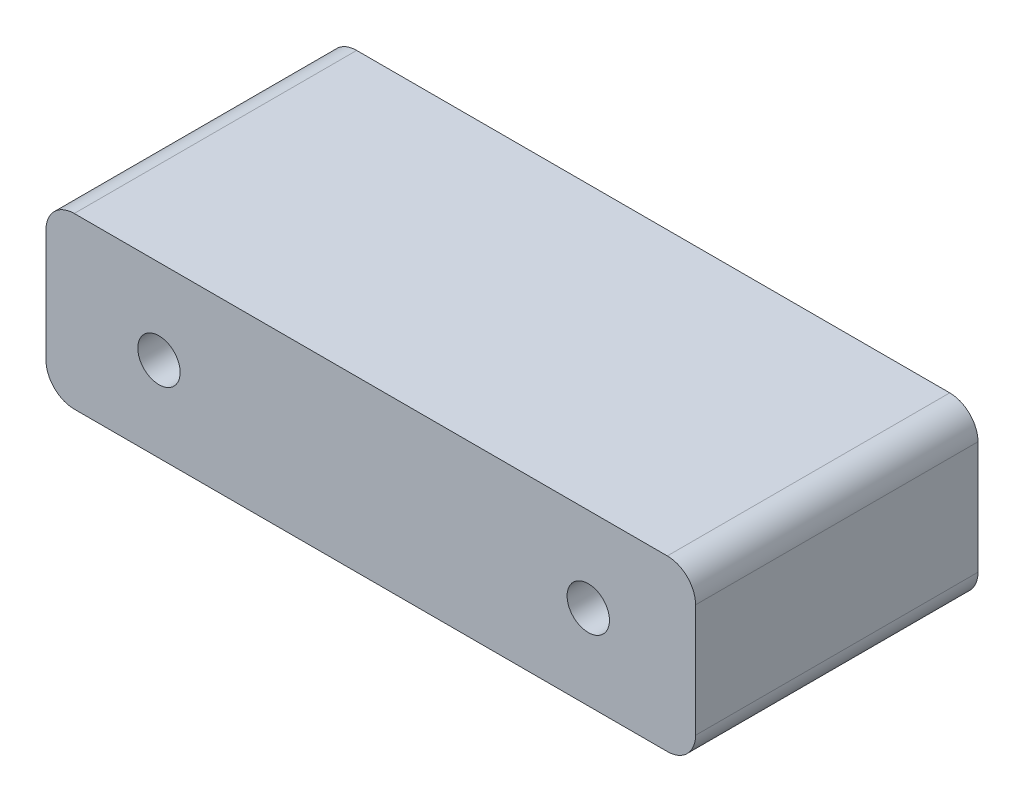
ISO-10303-21;
HEADER;
FILE_DESCRIPTION(('STEP AP214'),'2;1');
FILE_NAME('part.step','',(''),(''),'','','');
FILE_SCHEMA(('AUTOMOTIVE_DESIGN { 1 0 10303 214 1 1 1 1 }'));
ENDSEC;
DATA;
#1=APPLICATION_CONTEXT('core data for automotive mechanical design processes');
#2=APPLICATION_PROTOCOL_DEFINITION('international standard','automotive_design',2000,#1);
#3=PRODUCT_CONTEXT('',#1,'mechanical');
#4=PRODUCT('Part','Part','',(#3));
#5=PRODUCT_RELATED_PRODUCT_CATEGORY('part','',(#4));
#6=PRODUCT_DEFINITION_FORMATION('','',#4);
#7=PRODUCT_DEFINITION_CONTEXT('part definition',#1,'design');
#8=PRODUCT_DEFINITION('design','',#6,#7);
#9=PRODUCT_DEFINITION_SHAPE('','',#8);
#10=(LENGTH_UNIT() NAMED_UNIT(*) SI_UNIT(.MILLI.,.METRE.));
#11=(NAMED_UNIT(*) PLANE_ANGLE_UNIT() SI_UNIT($,.RADIAN.));
#12=(NAMED_UNIT(*) SI_UNIT($,.STERADIAN.) SOLID_ANGLE_UNIT());
#13=UNCERTAINTY_MEASURE_WITH_UNIT(LENGTH_MEASURE(1.E-05),#10,'distance_accuracy_value','');
#14=(GEOMETRIC_REPRESENTATION_CONTEXT(3) GLOBAL_UNCERTAINTY_ASSIGNED_CONTEXT((#13)) GLOBAL_UNIT_ASSIGNED_CONTEXT((#10,
#11,#12)) REPRESENTATION_CONTEXT('',''));
#15=CARTESIAN_POINT('',(0.,0.,0.));
#16=DIRECTION('',(0.,0.,1.));
#17=DIRECTION('',(1.,0.,0.));
#18=AXIS2_PLACEMENT_3D('',#15,#16,#17);
#19=CARTESIAN_POINT('',(0.,0.,10.));
#20=DIRECTION('',(0.,0.,1.));
#21=DIRECTION('',(1.,0.,0.));
#22=AXIS2_PLACEMENT_3D('',#19,#20,#21);
#23=PLANE('',#22);
#24=CARTESIAN_POINT('',(-2.35080745341615,0.311552795031056,10.));
#25=DIRECTION('',(0.,0.,1.));
#26=DIRECTION('',(1.,0.,0.));
#27=AXIS2_PLACEMENT_3D('',#24,#25,#26);
#28=CIRCLE('',#27,0.75);
#29=CARTESIAN_POINT('',(-1.60080745341615,0.311552795031056,10.));
#30=VERTEX_POINT('',#29);
#31=EDGE_CURVE('E138',#30,#30,#28,.T.);
#32=ORIENTED_EDGE('',*,*,#31,.F.);
#33=EDGE_LOOP('',(#32));
#34=FACE_BOUND('',#33,.T.);
#35=DIRECTION('',(1.,0.,0.));
#36=VECTOR('',#35,1.);
#37=CARTESIAN_POINT('',(16.6491925465839,-2.68844720496894,10.));
#38=LINE('',#37,#36);
#39=CARTESIAN_POINT('',(-5.35080745341615,-2.68844720496894,10.));
#40=VERTEX_POINT('',#39);
#41=CARTESIAN_POINT('',(15.6491925465838,-2.68844720496894,10.));
#42=VERTEX_POINT('',#41);
#43=EDGE_CURVE('E149',#40,#42,#38,.T.);
#44=ORIENTED_EDGE('',*,*,#43,.T.);
#45=CARTESIAN_POINT('',(15.6491925465838,-1.68844720496894,10.));
#46=DIRECTION('',(0.,0.,1.));
#47=DIRECTION('',(1.,0.,0.));
#48=AXIS2_PLACEMENT_3D('',#45,#46,#47);
#49=CIRCLE('',#48,1.);
#50=CARTESIAN_POINT('',(16.6491925465839,-1.68844720496894,10.));
#51=VERTEX_POINT('',#50);
#52=EDGE_CURVE('E179',#42,#51,#49,.T.);
#53=ORIENTED_EDGE('',*,*,#52,.T.);
#54=DIRECTION('',(0.,1.,0.));
#55=VECTOR('',#54,1.);
#56=CARTESIAN_POINT('',(16.6491925465839,-2.68844720496894,10.));
#57=LINE('',#56,#55);
#58=CARTESIAN_POINT('',(16.6491925465839,2.31155279503106,10.));
#59=VERTEX_POINT('',#58);
#60=EDGE_CURVE('E128',#51,#59,#57,.T.);
#61=ORIENTED_EDGE('',*,*,#60,.T.);
#62=CARTESIAN_POINT('',(15.6491925465838,2.31155279503106,10.));
#63=DIRECTION('',(0.,0.,1.));
#64=DIRECTION('',(1.,0.,0.));
#65=AXIS2_PLACEMENT_3D('',#62,#63,#64);
#66=CIRCLE('',#65,1.);
#67=CARTESIAN_POINT('',(15.6491925465838,3.31155279503106,10.));
#68=VERTEX_POINT('',#67);
#69=EDGE_CURVE('E176',#59,#68,#66,.T.);
#70=ORIENTED_EDGE('',*,*,#69,.T.);
#71=DIRECTION('',(-1.,0.,0.));
#72=VECTOR('',#71,1.);
#73=CARTESIAN_POINT('',(16.6491925465839,3.31155279503106,10.));
#74=LINE('',#73,#72);
#75=CARTESIAN_POINT('',(-5.35080745341615,3.31155279503106,10.));
#76=VERTEX_POINT('',#75);
#77=EDGE_CURVE('E205',#68,#76,#74,.T.);
#78=ORIENTED_EDGE('',*,*,#77,.T.);
#79=CARTESIAN_POINT('',(-5.35080745341615,2.31155279503106,10.));
#80=DIRECTION('',(0.,0.,1.));
#81=DIRECTION('',(1.,0.,0.));
#82=AXIS2_PLACEMENT_3D('',#79,#80,#81);
#83=CIRCLE('',#82,1.);
#84=CARTESIAN_POINT('',(-6.35080745341615,2.31155279503106,10.));
#85=VERTEX_POINT('',#84);
#86=EDGE_CURVE('E62',#76,#85,#83,.T.);
#87=ORIENTED_EDGE('',*,*,#86,.T.);
#88=DIRECTION('',(0.,-1.,0.));
#89=VECTOR('',#88,1.);
#90=CARTESIAN_POINT('',(-6.35080745341615,-2.68844720496894,10.));
#91=LINE('',#90,#89);
#92=CARTESIAN_POINT('',(-6.35080745341615,-1.68844720496894,10.));
#93=VERTEX_POINT('',#92);
#94=EDGE_CURVE('E193',#85,#93,#91,.T.);
#95=ORIENTED_EDGE('',*,*,#94,.T.);
#96=CARTESIAN_POINT('',(-5.35080745341615,-1.68844720496894,10.));
#97=DIRECTION('',(0.,0.,1.));
#98=DIRECTION('',(1.,0.,0.));
#99=AXIS2_PLACEMENT_3D('',#96,#97,#98);
#100=CIRCLE('',#99,1.);
#101=EDGE_CURVE('E173',#93,#40,#100,.T.);
#102=ORIENTED_EDGE('',*,*,#101,.T.);
#103=EDGE_LOOP('',(#44,#53,#61,#70,#78,#87,#95,#102));
#104=FACE_BOUND('',#103,.T.);
#105=CARTESIAN_POINT('',(12.8491925465839,0.311552795031056,10.));
#106=DIRECTION('',(0.,0.,1.));
#107=DIRECTION('',(1.,0.,0.));
#108=AXIS2_PLACEMENT_3D('',#105,#106,#107);
#109=CIRCLE('',#108,0.75);
#110=CARTESIAN_POINT('',(13.5991925465839,0.311552795031056,10.));
#111=VERTEX_POINT('',#110);
#112=EDGE_CURVE('E213',#111,#111,#109,.T.);
#113=ORIENTED_EDGE('',*,*,#112,.F.);
#114=EDGE_LOOP('',(#113));
#115=FACE_BOUND('',#114,.T.);
#116=ADVANCED_FACE('F41',(#34,#104,#115),#23,.T.);
#117=CARTESIAN_POINT('',(0.,0.,0.));
#118=DIRECTION('',(0.,0.,1.));
#119=DIRECTION('',(1.,0.,0.));
#120=AXIS2_PLACEMENT_3D('',#117,#118,#119);
#121=PLANE('',#120);
#122=DIRECTION('',(0.,1.,0.));
#123=VECTOR('',#122,1.);
#124=CARTESIAN_POINT('',(16.6491925465839,-2.68844720496894,0.));
#125=LINE('',#124,#123);
#126=CARTESIAN_POINT('',(16.6491925465839,-1.68844720496894,0.));
#127=VERTEX_POINT('',#126);
#128=CARTESIAN_POINT('',(16.6491925465839,2.31155279503106,0.));
#129=VERTEX_POINT('',#128);
#130=EDGE_CURVE('E125',#127,#129,#125,.T.);
#131=ORIENTED_EDGE('',*,*,#130,.F.);
#132=CARTESIAN_POINT('',(15.6491925465838,-1.68844720496894,0.));
#133=DIRECTION('',(0.,0.,1.));
#134=DIRECTION('',(1.,0.,0.));
#135=AXIS2_PLACEMENT_3D('',#132,#133,#134);
#136=CIRCLE('',#135,1.);
#137=CARTESIAN_POINT('',(15.6491925465838,-2.68844720496894,0.));
#138=VERTEX_POINT('',#137);
#139=EDGE_CURVE('E107',#127,#138,#136,.F.);
#140=ORIENTED_EDGE('',*,*,#139,.T.);
#141=DIRECTION('',(1.,0.,0.));
#142=VECTOR('',#141,1.);
#143=CARTESIAN_POINT('',(16.6491925465839,-2.68844720496894,0.));
#144=LINE('',#143,#142);
#145=CARTESIAN_POINT('',(-5.35080745341615,-2.68844720496894,0.));
#146=VERTEX_POINT('',#145);
#147=EDGE_CURVE('E154',#146,#138,#144,.T.);
#148=ORIENTED_EDGE('',*,*,#147,.F.);
#149=CARTESIAN_POINT('',(-5.35080745341615,-1.68844720496894,0.));
#150=DIRECTION('',(0.,0.,1.));
#151=DIRECTION('',(1.,0.,0.));
#152=AXIS2_PLACEMENT_3D('',#149,#150,#151);
#153=CIRCLE('',#152,1.);
#154=CARTESIAN_POINT('',(-6.35080745341615,-1.68844720496894,0.));
#155=VERTEX_POINT('',#154);
#156=EDGE_CURVE('E161',#146,#155,#153,.F.);
#157=ORIENTED_EDGE('',*,*,#156,.T.);
#158=DIRECTION('',(0.,-1.,0.));
#159=VECTOR('',#158,1.);
#160=CARTESIAN_POINT('',(-6.35080745341615,-2.68844720496894,0.));
#161=LINE('',#160,#159);
#162=CARTESIAN_POINT('',(-6.35080745341615,2.31155279503106,0.));
#163=VERTEX_POINT('',#162);
#164=EDGE_CURVE('E143',#163,#155,#161,.T.);
#165=ORIENTED_EDGE('',*,*,#164,.F.);
#166=CARTESIAN_POINT('',(-5.35080745341615,2.31155279503106,0.));
#167=DIRECTION('',(0.,0.,1.));
#168=DIRECTION('',(1.,0.,0.));
#169=AXIS2_PLACEMENT_3D('',#166,#167,#168);
#170=CIRCLE('',#169,1.);
#171=CARTESIAN_POINT('',(-5.35080745341615,3.31155279503106,0.));
#172=VERTEX_POINT('',#171);
#173=EDGE_CURVE('E130',#163,#172,#170,.F.);
#174=ORIENTED_EDGE('',*,*,#173,.T.);
#175=DIRECTION('',(-1.,0.,0.));
#176=VECTOR('',#175,1.);
#177=CARTESIAN_POINT('',(16.6491925465839,3.31155279503106,0.));
#178=LINE('',#177,#176);
#179=CARTESIAN_POINT('',(15.6491925465838,3.31155279503106,0.));
#180=VERTEX_POINT('',#179);
#181=EDGE_CURVE('E137',#180,#172,#178,.T.);
#182=ORIENTED_EDGE('',*,*,#181,.F.);
#183=CARTESIAN_POINT('',(15.6491925465838,2.31155279503106,0.));
#184=DIRECTION('',(0.,0.,1.));
#185=DIRECTION('',(1.,0.,0.));
#186=AXIS2_PLACEMENT_3D('',#183,#184,#185);
#187=CIRCLE('',#186,1.);
#188=EDGE_CURVE('E119',#180,#129,#187,.F.);
#189=ORIENTED_EDGE('',*,*,#188,.T.);
#190=EDGE_LOOP('',(#131,#140,#148,#157,#165,#174,#182,#189));
#191=FACE_BOUND('',#190,.T.);
#192=CARTESIAN_POINT('',(-2.35080745341615,0.311552795031056,0.));
#193=DIRECTION('',(0.,0.,1.));
#194=DIRECTION('',(1.,0.,0.));
#195=AXIS2_PLACEMENT_3D('',#192,#193,#194);
#196=CIRCLE('',#195,0.75);
#197=CARTESIAN_POINT('',(-1.60080745341615,0.311552795031056,0.));
#198=VERTEX_POINT('',#197);
#199=EDGE_CURVE('E146',#198,#198,#196,.T.);
#200=ORIENTED_EDGE('',*,*,#199,.T.);
#201=EDGE_LOOP('',(#200));
#202=FACE_BOUND('',#201,.T.);
#203=CARTESIAN_POINT('',(12.8491925465839,0.311552795031056,0.));
#204=DIRECTION('',(0.,0.,1.));
#205=DIRECTION('',(1.,0.,0.));
#206=AXIS2_PLACEMENT_3D('',#203,#204,#205);
#207=CIRCLE('',#206,0.75);
#208=CARTESIAN_POINT('',(13.5991925465839,0.311552795031056,0.));
#209=VERTEX_POINT('',#208);
#210=EDGE_CURVE('E215',#209,#209,#207,.T.);
#211=ORIENTED_EDGE('',*,*,#210,.T.);
#212=EDGE_LOOP('',(#211));
#213=FACE_BOUND('',#212,.T.);
#214=ADVANCED_FACE('F133',(#191,#202,#213),#121,.F.);
#215=CARTESIAN_POINT('',(16.6491925465839,-2.68844720496894,10.));
#216=DIRECTION('',(-1.,0.,0.));
#217=DIRECTION('',(0.,0.,1.));
#218=AXIS2_PLACEMENT_3D('',#215,#216,#217);
#219=PLANE('',#218);
#220=ORIENTED_EDGE('',*,*,#60,.F.);
#221=DIRECTION('',(0.,0.,-1.));
#222=VECTOR('',#221,1.);
#223=CARTESIAN_POINT('',(16.6491925465839,-1.68844720496894,10.));
#224=LINE('',#223,#222);
#225=EDGE_CURVE('E111',#51,#127,#224,.T.);
#226=ORIENTED_EDGE('',*,*,#225,.T.);
#227=ORIENTED_EDGE('',*,*,#130,.T.);
#228=DIRECTION('',(0.,0.,-1.));
#229=VECTOR('',#228,1.);
#230=CARTESIAN_POINT('',(16.6491925465839,2.31155279503106,10.));
#231=LINE('',#230,#229);
#232=EDGE_CURVE('E131',#129,#59,#231,.F.);
#233=ORIENTED_EDGE('',*,*,#232,.T.);
#234=EDGE_LOOP('',(#220,#226,#227,#233));
#235=FACE_BOUND('',#234,.T.);
#236=ADVANCED_FACE('F124',(#235),#219,.F.);
#237=CARTESIAN_POINT('',(16.6491925465839,3.31155279503106,10.));
#238=DIRECTION('',(0.,-1.,0.));
#239=DIRECTION('',(0.,0.,-1.));
#240=AXIS2_PLACEMENT_3D('',#237,#238,#239);
#241=PLANE('',#240);
#242=ORIENTED_EDGE('',*,*,#77,.F.);
#243=DIRECTION('',(0.,0.,-1.));
#244=VECTOR('',#243,1.);
#245=CARTESIAN_POINT('',(15.6491925465838,3.31155279503106,10.));
#246=LINE('',#245,#244);
#247=EDGE_CURVE('E185',#68,#180,#246,.T.);
#248=ORIENTED_EDGE('',*,*,#247,.T.);
#249=ORIENTED_EDGE('',*,*,#181,.T.);
#250=DIRECTION('',(0.,0.,-1.));
#251=VECTOR('',#250,1.);
#252=CARTESIAN_POINT('',(-5.35080745341615,3.31155279503106,10.));
#253=LINE('',#252,#251);
#254=EDGE_CURVE('E182',#172,#76,#253,.F.);
#255=ORIENTED_EDGE('',*,*,#254,.T.);
#256=EDGE_LOOP('',(#242,#248,#249,#255));
#257=FACE_BOUND('',#256,.T.);
#258=ADVANCED_FACE('F242',(#257),#241,.F.);
#259=CARTESIAN_POINT('',(-6.35080745341615,-2.68844720496894,10.));
#260=DIRECTION('',(1.,0.,0.));
#261=DIRECTION('',(0.,0.,-1.));
#262=AXIS2_PLACEMENT_3D('',#259,#260,#261);
#263=PLANE('',#262);
#264=ORIENTED_EDGE('',*,*,#164,.T.);
#265=DIRECTION('',(0.,0.,-1.));
#266=VECTOR('',#265,1.);
#267=CARTESIAN_POINT('',(-6.35080745341615,-1.68844720496894,10.));
#268=LINE('',#267,#266);
#269=EDGE_CURVE('E11',#155,#93,#268,.F.);
#270=ORIENTED_EDGE('',*,*,#269,.T.);
#271=ORIENTED_EDGE('',*,*,#94,.F.);
#272=DIRECTION('',(0.,0.,-1.));
#273=VECTOR('',#272,1.);
#274=CARTESIAN_POINT('',(-6.35080745341615,2.31155279503106,10.));
#275=LINE('',#274,#273);
#276=EDGE_CURVE('E50',#85,#163,#275,.T.);
#277=ORIENTED_EDGE('',*,*,#276,.T.);
#278=EDGE_LOOP('',(#264,#270,#271,#277));
#279=FACE_BOUND('',#278,.T.);
#280=ADVANCED_FACE('F192',(#279),#263,.F.);
#281=CARTESIAN_POINT('',(16.6491925465839,-2.68844720496894,10.));
#282=DIRECTION('',(0.,1.,0.));
#283=DIRECTION('',(0.,0.,1.));
#284=AXIS2_PLACEMENT_3D('',#281,#282,#283);
#285=PLANE('',#284);
#286=ORIENTED_EDGE('',*,*,#147,.T.);
#287=DIRECTION('',(0.,0.,-1.));
#288=VECTOR('',#287,1.);
#289=CARTESIAN_POINT('',(15.6491925465838,-2.68844720496894,10.));
#290=LINE('',#289,#288);
#291=EDGE_CURVE('E112',#138,#42,#290,.F.);
#292=ORIENTED_EDGE('',*,*,#291,.T.);
#293=ORIENTED_EDGE('',*,*,#43,.F.);
#294=DIRECTION('',(0.,0.,-1.));
#295=VECTOR('',#294,1.);
#296=CARTESIAN_POINT('',(-5.35080745341615,-2.68844720496894,10.));
#297=LINE('',#296,#295);
#298=EDGE_CURVE('E118',#40,#146,#297,.T.);
#299=ORIENTED_EDGE('',*,*,#298,.T.);
#300=EDGE_LOOP('',(#286,#292,#293,#299));
#301=FACE_BOUND('',#300,.T.);
#302=ADVANCED_FACE('F201',(#301),#285,.F.);
#303=CARTESIAN_POINT('',(-2.35080745341615,0.311552795031056,10.));
#304=DIRECTION('',(0.,0.,-1.));
#305=DIRECTION('',(-1.,0.,0.));
#306=AXIS2_PLACEMENT_3D('',#303,#304,#305);
#307=CYLINDRICAL_SURFACE('',#306,0.75);
#308=ORIENTED_EDGE('',*,*,#31,.T.);
#309=EDGE_LOOP('',(#308));
#310=FACE_BOUND('',#309,.T.);
#311=ORIENTED_EDGE('',*,*,#199,.F.);
#312=EDGE_LOOP('',(#311));
#313=FACE_BOUND('',#312,.T.);
#314=ADVANCED_FACE('F235',(#310,#313),#307,.F.);
#315=CARTESIAN_POINT('',(12.8491925465839,0.311552795031056,10.));
#316=DIRECTION('',(0.,0.,-1.));
#317=DIRECTION('',(-1.,0.,0.));
#318=AXIS2_PLACEMENT_3D('',#315,#316,#317);
#319=CYLINDRICAL_SURFACE('',#318,0.75);
#320=ORIENTED_EDGE('',*,*,#112,.T.);
#321=EDGE_LOOP('',(#320));
#322=FACE_BOUND('',#321,.T.);
#323=ORIENTED_EDGE('',*,*,#210,.F.);
#324=EDGE_LOOP('',(#323));
#325=FACE_BOUND('',#324,.T.);
#326=ADVANCED_FACE('F223',(#322,#325),#319,.F.);
#327=CARTESIAN_POINT('',(15.6491925465838,-1.68844720496894,10.));
#328=DIRECTION('',(0.,0.,-1.));
#329=DIRECTION('',(-1.,0.,0.));
#330=AXIS2_PLACEMENT_3D('',#327,#328,#329);
#331=CYLINDRICAL_SURFACE('',#330,1.);
#332=ORIENTED_EDGE('',*,*,#52,.F.);
#333=ORIENTED_EDGE('',*,*,#291,.F.);
#334=ORIENTED_EDGE('',*,*,#139,.F.);
#335=ORIENTED_EDGE('',*,*,#225,.F.);
#336=EDGE_LOOP('',(#332,#333,#334,#335));
#337=FACE_BOUND('',#336,.T.);
#338=ADVANCED_FACE('F110',(#337),#331,.T.);
#339=CARTESIAN_POINT('',(15.6491925465838,2.31155279503106,10.));
#340=DIRECTION('',(0.,0.,-1.));
#341=DIRECTION('',(-1.,0.,0.));
#342=AXIS2_PLACEMENT_3D('',#339,#340,#341);
#343=CYLINDRICAL_SURFACE('',#342,1.);
#344=ORIENTED_EDGE('',*,*,#69,.F.);
#345=ORIENTED_EDGE('',*,*,#232,.F.);
#346=ORIENTED_EDGE('',*,*,#188,.F.);
#347=ORIENTED_EDGE('',*,*,#247,.F.);
#348=EDGE_LOOP('',(#344,#345,#346,#347));
#349=FACE_BOUND('',#348,.T.);
#350=ADVANCED_FACE('F250',(#349),#343,.T.);
#351=CARTESIAN_POINT('',(-5.35080745341615,-1.68844720496894,10.));
#352=DIRECTION('',(0.,0.,-1.));
#353=DIRECTION('',(-1.,0.,0.));
#354=AXIS2_PLACEMENT_3D('',#351,#352,#353);
#355=CYLINDRICAL_SURFACE('',#354,1.);
#356=ORIENTED_EDGE('',*,*,#101,.F.);
#357=ORIENTED_EDGE('',*,*,#269,.F.);
#358=ORIENTED_EDGE('',*,*,#156,.F.);
#359=ORIENTED_EDGE('',*,*,#298,.F.);
#360=EDGE_LOOP('',(#356,#357,#358,#359));
#361=FACE_BOUND('',#360,.T.);
#362=ADVANCED_FACE('F198',(#361),#355,.T.);
#363=CARTESIAN_POINT('',(-5.35080745341615,2.31155279503106,10.));
#364=DIRECTION('',(0.,0.,-1.));
#365=DIRECTION('',(-1.,0.,0.));
#366=AXIS2_PLACEMENT_3D('',#363,#364,#365);
#367=CYLINDRICAL_SURFACE('',#366,1.);
#368=ORIENTED_EDGE('',*,*,#86,.F.);
#369=ORIENTED_EDGE('',*,*,#254,.F.);
#370=ORIENTED_EDGE('',*,*,#173,.F.);
#371=ORIENTED_EDGE('',*,*,#276,.F.);
#372=EDGE_LOOP('',(#368,#369,#370,#371));
#373=FACE_BOUND('',#372,.T.);
#374=ADVANCED_FACE('F43',(#373),#367,.T.);
#375=CLOSED_SHELL('',(#116,#214,#236,#258,#280,#302,#314,#326,#338,#350,#362,#374));
#376=MANIFOLD_SOLID_BREP('B2',#375);
#377=ADVANCED_BREP_SHAPE_REPRESENTATION('',(#18,#376),#14);
#378=SHAPE_DEFINITION_REPRESENTATION(#9,#377);
ENDSEC;
END-ISO-10303-21;
